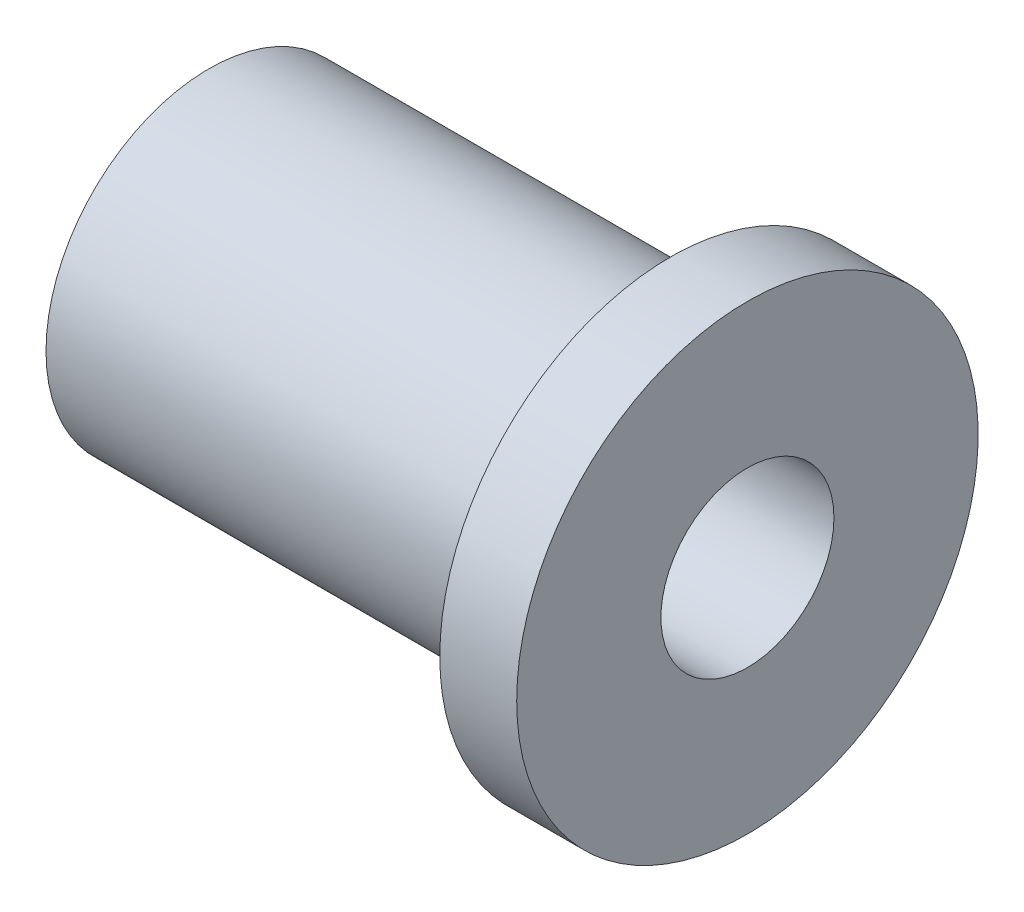
ISO-10303-21;
HEADER;
FILE_DESCRIPTION(('STEP AP214'),'2;1');
FILE_NAME('part.step','',(''),(''),'','','');
FILE_SCHEMA(('AUTOMOTIVE_DESIGN { 1 0 10303 214 1 1 1 1 }'));
ENDSEC;
DATA;
#1=APPLICATION_CONTEXT('core data for automotive mechanical design processes');
#2=APPLICATION_PROTOCOL_DEFINITION('international standard','automotive_design',2000,#1);
#3=PRODUCT_CONTEXT('',#1,'mechanical');
#4=PRODUCT('Part','Part','',(#3));
#5=PRODUCT_RELATED_PRODUCT_CATEGORY('part','',(#4));
#6=PRODUCT_DEFINITION_FORMATION('','',#4);
#7=PRODUCT_DEFINITION_CONTEXT('part definition',#1,'design');
#8=PRODUCT_DEFINITION('design','',#6,#7);
#9=PRODUCT_DEFINITION_SHAPE('','',#8);
#10=(LENGTH_UNIT() NAMED_UNIT(*) SI_UNIT(.MILLI.,.METRE.));
#11=(NAMED_UNIT(*) PLANE_ANGLE_UNIT() SI_UNIT($,.RADIAN.));
#12=(NAMED_UNIT(*) SI_UNIT($,.STERADIAN.) SOLID_ANGLE_UNIT());
#13=UNCERTAINTY_MEASURE_WITH_UNIT(LENGTH_MEASURE(1.E-05),#10,'distance_accuracy_value','');
#14=(GEOMETRIC_REPRESENTATION_CONTEXT(3) GLOBAL_UNCERTAINTY_ASSIGNED_CONTEXT((#13)) GLOBAL_UNIT_ASSIGNED_CONTEXT((#10,
#11,#12)) REPRESENTATION_CONTEXT('',''));
#15=CARTESIAN_POINT('',(0.,0.,0.));
#16=DIRECTION('',(0.,0.,1.));
#17=DIRECTION('',(1.,0.,0.));
#18=AXIS2_PLACEMENT_3D('',#15,#16,#17);
#19=CARTESIAN_POINT('',(0.,0.,0.));
#20=DIRECTION('',(1.,0.,0.));
#21=DIRECTION('',(0.,0.,-1.));
#22=AXIS2_PLACEMENT_3D('',#19,#20,#21);
#23=PLANE('',#22);
#24=CARTESIAN_POINT('',(0.,0.,0.));
#25=DIRECTION('',(-1.,0.,0.));
#26=DIRECTION('',(0.,0.,1.));
#27=AXIS2_PLACEMENT_3D('',#24,#25,#26);
#28=CIRCLE('',#27,4.21639999999999);
#29=CARTESIAN_POINT('',(0.,0.,4.21639999999999));
#30=VERTEX_POINT('',#29);
#31=EDGE_CURVE('E58',#30,#30,#28,.T.);
#32=ORIENTED_EDGE('',*,*,#31,.F.);
#33=EDGE_LOOP('',(#32));
#34=FACE_BOUND('',#33,.T.);
#35=CARTESIAN_POINT('',(0.,0.,0.));
#36=DIRECTION('',(-1.,0.,0.));
#37=DIRECTION('',(0.,0.,1.));
#38=AXIS2_PLACEMENT_3D('',#35,#36,#37);
#39=CIRCLE('',#38,6.731);
#40=CARTESIAN_POINT('',(0.,0.,6.731));
#41=VERTEX_POINT('',#40);
#42=EDGE_CURVE('E10',#41,#41,#39,.T.);
#43=ORIENTED_EDGE('',*,*,#42,.T.);
#44=EDGE_LOOP('',(#43));
#45=FACE_BOUND('',#44,.T.);
#46=ADVANCED_FACE('F33',(#34,#45),#23,.F.);
#47=CARTESIAN_POINT('',(0.,0.,0.));
#48=DIRECTION('',(-1.,0.,0.));
#49=DIRECTION('',(0.,0.,1.));
#50=AXIS2_PLACEMENT_3D('',#47,#48,#49);
#51=CYLINDRICAL_SURFACE('',#50,6.731);
#52=ORIENTED_EDGE('',*,*,#42,.F.);
#53=EDGE_LOOP('',(#52));
#54=FACE_BOUND('',#53,.T.);
#55=CARTESIAN_POINT('',(19.05,0.,0.));
#56=DIRECTION('',(-1.,0.,0.));
#57=DIRECTION('',(0.,0.,1.));
#58=AXIS2_PLACEMENT_3D('',#55,#56,#57);
#59=CIRCLE('',#58,6.731);
#60=CARTESIAN_POINT('',(19.05,0.,6.731));
#61=VERTEX_POINT('',#60);
#62=EDGE_CURVE('E40',#61,#61,#59,.T.);
#63=ORIENTED_EDGE('',*,*,#62,.T.);
#64=EDGE_LOOP('',(#63));
#65=FACE_BOUND('',#64,.T.);
#66=ADVANCED_FACE('F65',(#54,#65),#51,.T.);
#67=CARTESIAN_POINT('',(19.05,6.731,0.));
#68=DIRECTION('',(1.,0.,0.));
#69=DIRECTION('',(0.,0.,-1.));
#70=AXIS2_PLACEMENT_3D('',#67,#68,#69);
#71=PLANE('',#70);
#72=ORIENTED_EDGE('',*,*,#62,.F.);
#73=EDGE_LOOP('',(#72));
#74=FACE_BOUND('',#73,.T.);
#75=CARTESIAN_POINT('',(19.05,0.,0.));
#76=DIRECTION('',(-1.,0.,0.));
#77=DIRECTION('',(0.,0.,1.));
#78=AXIS2_PLACEMENT_3D('',#75,#76,#77);
#79=CIRCLE('',#78,9.525);
#80=CARTESIAN_POINT('',(19.05,0.,9.525));
#81=VERTEX_POINT('',#80);
#82=EDGE_CURVE('E44',#81,#81,#79,.T.);
#83=ORIENTED_EDGE('',*,*,#82,.T.);
#84=EDGE_LOOP('',(#83));
#85=FACE_BOUND('',#84,.T.);
#86=ADVANCED_FACE('F69',(#74,#85),#71,.F.);
#87=CARTESIAN_POINT('',(0.,0.,0.));
#88=DIRECTION('',(-1.,0.,0.));
#89=DIRECTION('',(0.,0.,1.));
#90=AXIS2_PLACEMENT_3D('',#87,#88,#89);
#91=CYLINDRICAL_SURFACE('',#90,9.525);
#92=ORIENTED_EDGE('',*,*,#82,.F.);
#93=EDGE_LOOP('',(#92));
#94=FACE_BOUND('',#93,.T.);
#95=CARTESIAN_POINT('',(22.225,0.,0.));
#96=DIRECTION('',(-1.,0.,0.));
#97=DIRECTION('',(0.,0.,1.));
#98=AXIS2_PLACEMENT_3D('',#95,#96,#97);
#99=CIRCLE('',#98,9.525);
#100=CARTESIAN_POINT('',(22.225,0.,9.525));
#101=VERTEX_POINT('',#100);
#102=EDGE_CURVE('E49',#101,#101,#99,.T.);
#103=ORIENTED_EDGE('',*,*,#102,.T.);
#104=EDGE_LOOP('',(#103));
#105=FACE_BOUND('',#104,.T.);
#106=ADVANCED_FACE('F74',(#94,#105),#91,.T.);
#107=CARTESIAN_POINT('',(22.225,9.525,0.));
#108=DIRECTION('',(-1.,0.,0.));
#109=DIRECTION('',(0.,0.,1.));
#110=AXIS2_PLACEMENT_3D('',#107,#108,#109);
#111=PLANE('',#110);
#112=CARTESIAN_POINT('',(22.225,0.,0.));
#113=DIRECTION('',(1.,0.,0.));
#114=DIRECTION('',(0.,0.,-1.));
#115=AXIS2_PLACEMENT_3D('',#112,#113,#114);
#116=CIRCLE('',#115,3.571875);
#117=CARTESIAN_POINT('',(22.225,0.,-3.571875));
#118=VERTEX_POINT('',#117);
#119=EDGE_CURVE('E52',#118,#118,#116,.T.);
#120=ORIENTED_EDGE('',*,*,#119,.F.);
#121=EDGE_LOOP('',(#120));
#122=FACE_BOUND('',#121,.T.);
#123=ORIENTED_EDGE('',*,*,#102,.F.);
#124=EDGE_LOOP('',(#123));
#125=FACE_BOUND('',#124,.T.);
#126=ADVANCED_FACE('F81',(#122,#125),#111,.F.);
#127=CARTESIAN_POINT('',(22.225,0.,0.));
#128=DIRECTION('',(1.,0.,0.));
#129=DIRECTION('',(0.,0.,-1.));
#130=AXIS2_PLACEMENT_3D('',#127,#128,#129);
#131=CYLINDRICAL_SURFACE('',#130,3.571875);
#132=CARTESIAN_POINT('',(13.0872696904787,0.,0.));
#133=DIRECTION('',(-1.,0.,0.));
#134=DIRECTION('',(0.,0.,1.));
#135=AXIS2_PLACEMENT_3D('',#132,#133,#134);
#136=CIRCLE('',#135,3.571875);
#137=CARTESIAN_POINT('',(13.0872696904787,0.,3.571875));
#138=VERTEX_POINT('',#137);
#139=EDGE_CURVE('E36',#138,#138,#136,.T.);
#140=ORIENTED_EDGE('',*,*,#139,.T.);
#141=EDGE_LOOP('',(#140));
#142=FACE_BOUND('',#141,.T.);
#143=ORIENTED_EDGE('',*,*,#119,.T.);
#144=EDGE_LOOP('',(#143));
#145=FACE_BOUND('',#144,.T.);
#146=ADVANCED_FACE('F85',(#142,#145),#131,.F.);
#147=CARTESIAN_POINT('',(12.7,0.,0.));
#148=DIRECTION('',(-1.,0.,0.));
#149=DIRECTION('',(0.,0.,1.));
#150=AXIS2_PLACEMENT_3D('',#147,#148,#149);
#151=CONICAL_SURFACE('',#150,4.2164,1.02974425867665);
#152=CARTESIAN_POINT('',(12.7,0.,0.));
#153=DIRECTION('',(-1.,0.,0.));
#154=DIRECTION('',(0.,0.,1.));
#155=AXIS2_PLACEMENT_3D('',#152,#153,#154);
#156=CIRCLE('',#155,4.2164);
#157=CARTESIAN_POINT('',(12.7,0.,4.2164));
#158=VERTEX_POINT('',#157);
#159=EDGE_CURVE('E55',#158,#158,#156,.T.);
#160=ORIENTED_EDGE('',*,*,#159,.T.);
#161=EDGE_LOOP('',(#160));
#162=FACE_BOUND('',#161,.T.);
#163=ORIENTED_EDGE('',*,*,#139,.F.);
#164=EDGE_LOOP('',(#163));
#165=FACE_BOUND('',#164,.T.);
#166=ADVANCED_FACE('F89',(#162,#165),#151,.F.);
#167=CARTESIAN_POINT('',(0.,0.,0.));
#168=DIRECTION('',(-1.,0.,0.));
#169=DIRECTION('',(0.,0.,1.));
#170=AXIS2_PLACEMENT_3D('',#167,#168,#169);
#171=CYLINDRICAL_SURFACE('',#170,4.21639999999999);
#172=ORIENTED_EDGE('',*,*,#159,.F.);
#173=EDGE_LOOP('',(#172));
#174=FACE_BOUND('',#173,.T.);
#175=ORIENTED_EDGE('',*,*,#31,.T.);
#176=EDGE_LOOP('',(#175));
#177=FACE_BOUND('',#176,.T.);
#178=ADVANCED_FACE('F62',(#174,#177),#171,.F.);
#179=CLOSED_SHELL('',(#46,#66,#86,#106,#126,#146,#166,#178));
#180=MANIFOLD_SOLID_BREP('B2',#179);
#181=ADVANCED_BREP_SHAPE_REPRESENTATION('',(#18,#180),#14);
#182=SHAPE_DEFINITION_REPRESENTATION(#9,#181);
ENDSEC;
END-ISO-10303-21;
